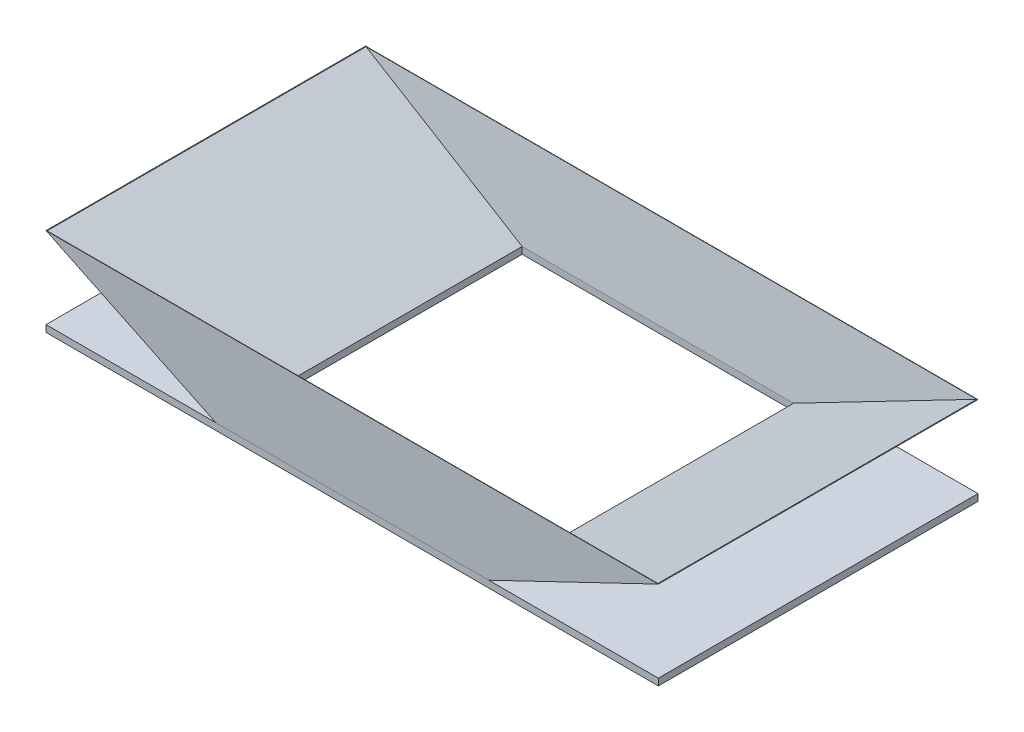
ISO-10303-21;
HEADER;
FILE_DESCRIPTION(('STEP AP214'),'2;1');
FILE_NAME('part.step','',(''),(''),'','','');
FILE_SCHEMA(('AUTOMOTIVE_DESIGN { 1 0 10303 214 1 1 1 1 }'));
ENDSEC;
DATA;
#1=APPLICATION_CONTEXT('core data for automotive mechanical design processes');
#2=APPLICATION_PROTOCOL_DEFINITION('international standard','automotive_design',2000,#1);
#3=PRODUCT_CONTEXT('',#1,'mechanical');
#4=PRODUCT('Part','Part','',(#3));
#5=PRODUCT_RELATED_PRODUCT_CATEGORY('part','',(#4));
#6=PRODUCT_DEFINITION_FORMATION('','',#4);
#7=PRODUCT_DEFINITION_CONTEXT('part definition',#1,'design');
#8=PRODUCT_DEFINITION('design','',#6,#7);
#9=PRODUCT_DEFINITION_SHAPE('','',#8);
#10=(LENGTH_UNIT() NAMED_UNIT(*) SI_UNIT(.MILLI.,.METRE.));
#11=(NAMED_UNIT(*) PLANE_ANGLE_UNIT() SI_UNIT($,.RADIAN.));
#12=(NAMED_UNIT(*) SI_UNIT($,.STERADIAN.) SOLID_ANGLE_UNIT());
#13=UNCERTAINTY_MEASURE_WITH_UNIT(LENGTH_MEASURE(1.E-05),#10,'distance_accuracy_value','');
#14=(GEOMETRIC_REPRESENTATION_CONTEXT(3) GLOBAL_UNCERTAINTY_ASSIGNED_CONTEXT((#13)) GLOBAL_UNIT_ASSIGNED_CONTEXT((#10,
#11,#12)) REPRESENTATION_CONTEXT('',''));
#15=CARTESIAN_POINT('',(0.,0.,0.));
#16=DIRECTION('',(0.,0.,1.));
#17=DIRECTION('',(1.,0.,0.));
#18=AXIS2_PLACEMENT_3D('',#15,#16,#17);
#19=CARTESIAN_POINT('',(0.,0.,0.));
#20=DIRECTION('',(0.,1.,0.));
#21=DIRECTION('',(0.,0.,1.));
#22=AXIS2_PLACEMENT_3D('',#19,#20,#21);
#23=PLANE('',#22);
#24=DIRECTION('',(0.,0.,1.));
#25=VECTOR('',#24,1.);
#26=CARTESIAN_POINT('',(-229.18696964241,0.,-124.717503613783));
#27=LINE('',#26,#25);
#28=CARTESIAN_POINT('',(-229.18696964241,0.,-124.717503613783));
#29=VERTEX_POINT('',#28);
#30=CARTESIAN_POINT('',(-229.18696964241,0.,114.554));
#31=VERTEX_POINT('',#30);
#32=EDGE_CURVE('E269',#29,#31,#27,.T.);
#33=ORIENTED_EDGE('',*,*,#32,.T.);
#34=DIRECTION('',(1.,0.,0.));
#35=VECTOR('',#34,1.);
#36=CARTESIAN_POINT('',(-229.18696964241,0.,114.554));
#37=LINE('',#36,#35);
#38=CARTESIAN_POINT('',(229.18696964241,0.,114.554));
#39=VERTEX_POINT('',#38);
#40=EDGE_CURVE('E273',#31,#39,#37,.T.);
#41=ORIENTED_EDGE('',*,*,#40,.T.);
#42=DIRECTION('',(0.,0.,-1.));
#43=VECTOR('',#42,1.);
#44=CARTESIAN_POINT('',(229.18696964241,0.,-124.717503613783));
#45=LINE('',#44,#43);
#46=CARTESIAN_POINT('',(229.18696964241,0.,-124.717503613783));
#47=VERTEX_POINT('',#46);
#48=EDGE_CURVE('E277',#39,#47,#45,.T.);
#49=ORIENTED_EDGE('',*,*,#48,.T.);
#50=DIRECTION('',(-1.,0.,0.));
#51=VECTOR('',#50,1.);
#52=CARTESIAN_POINT('',(-229.18696964241,0.,-124.717503613783));
#53=LINE('',#52,#51);
#54=EDGE_CURVE('E280',#47,#29,#53,.T.);
#55=ORIENTED_EDGE('',*,*,#54,.T.);
#56=EDGE_LOOP('',(#33,#41,#49,#55));
#57=FACE_BOUND('',#56,.T.);
#58=DIRECTION('',(1.,0.,0.));
#59=VECTOR('',#58,1.);
#60=CARTESIAN_POINT('',(-101.6,0.,114.3));
#61=LINE('',#60,#59);
#62=CARTESIAN_POINT('',(-101.6,0.,114.3));
#63=VERTEX_POINT('',#62);
#64=CARTESIAN_POINT('',(101.6,0.,114.3));
#65=VERTEX_POINT('',#64);
#66=EDGE_CURVE('E230',#63,#65,#61,.T.);
#67=ORIENTED_EDGE('',*,*,#66,.F.);
#68=DIRECTION('',(0.,0.,1.));
#69=VECTOR('',#68,1.);
#70=CARTESIAN_POINT('',(-101.6,0.,-114.3));
#71=LINE('',#70,#69);
#72=CARTESIAN_POINT('',(-101.6,0.,-114.3));
#73=VERTEX_POINT('',#72);
#74=EDGE_CURVE('E221',#73,#63,#71,.T.);
#75=ORIENTED_EDGE('',*,*,#74,.F.);
#76=DIRECTION('',(-1.,0.,0.));
#77=VECTOR('',#76,1.);
#78=CARTESIAN_POINT('',(-101.6,0.,-114.3));
#79=LINE('',#78,#77);
#80=CARTESIAN_POINT('',(101.6,0.,-114.3));
#81=VERTEX_POINT('',#80);
#82=EDGE_CURVE('E247',#81,#73,#79,.T.);
#83=ORIENTED_EDGE('',*,*,#82,.F.);
#84=DIRECTION('',(0.,0.,-1.));
#85=VECTOR('',#84,1.);
#86=CARTESIAN_POINT('',(101.6,0.,-114.3));
#87=LINE('',#86,#85);
#88=EDGE_CURVE('E243',#65,#81,#87,.T.);
#89=ORIENTED_EDGE('',*,*,#88,.F.);
#90=EDGE_LOOP('',(#67,#75,#83,#89));
#91=FACE_BOUND('',#90,.T.);
#92=ADVANCED_FACE('F155',(#57,#91),#23,.T.);
#93=CARTESIAN_POINT('',(0.,-5.08,0.));
#94=DIRECTION('',(0.,1.,0.));
#95=DIRECTION('',(0.,0.,1.));
#96=AXIS2_PLACEMENT_3D('',#93,#94,#95);
#97=PLANE('',#96);
#98=DIRECTION('',(0.,0.,1.));
#99=VECTOR('',#98,1.);
#100=CARTESIAN_POINT('',(-229.18696964241,-5.08,-124.717503613783));
#101=LINE('',#100,#99);
#102=CARTESIAN_POINT('',(-229.18696964241,-5.08,-124.717503613783));
#103=VERTEX_POINT('',#102);
#104=CARTESIAN_POINT('',(-229.18696964241,-5.08,114.554));
#105=VERTEX_POINT('',#104);
#106=EDGE_CURVE('E239',#103,#105,#101,.T.);
#107=ORIENTED_EDGE('',*,*,#106,.F.);
#108=DIRECTION('',(-1.,0.,0.));
#109=VECTOR('',#108,1.);
#110=CARTESIAN_POINT('',(-229.18696964241,-5.08,-124.717503613783));
#111=LINE('',#110,#109);
#112=CARTESIAN_POINT('',(229.18696964241,-5.08,-124.717503613783));
#113=VERTEX_POINT('',#112);
#114=EDGE_CURVE('E274',#113,#103,#111,.T.);
#115=ORIENTED_EDGE('',*,*,#114,.F.);
#116=DIRECTION('',(0.,0.,-1.));
#117=VECTOR('',#116,1.);
#118=CARTESIAN_POINT('',(229.18696964241,-5.08,-124.717503613783));
#119=LINE('',#118,#117);
#120=CARTESIAN_POINT('',(229.18696964241,-5.08,114.554));
#121=VERTEX_POINT('',#120);
#122=EDGE_CURVE('E290',#121,#113,#119,.T.);
#123=ORIENTED_EDGE('',*,*,#122,.F.);
#124=DIRECTION('',(1.,0.,0.));
#125=VECTOR('',#124,1.);
#126=CARTESIAN_POINT('',(-229.18696964241,-5.08,114.554));
#127=LINE('',#126,#125);
#128=EDGE_CURVE('E287',#105,#121,#127,.T.);
#129=ORIENTED_EDGE('',*,*,#128,.F.);
#130=EDGE_LOOP('',(#107,#115,#123,#129));
#131=FACE_BOUND('',#130,.T.);
#132=DIRECTION('',(0.,0.,1.));
#133=VECTOR('',#132,1.);
#134=CARTESIAN_POINT('',(-101.6,-5.08,-114.3));
#135=LINE('',#134,#133);
#136=CARTESIAN_POINT('',(-101.6,-5.08,-114.3));
#137=VERTEX_POINT('',#136);
#138=CARTESIAN_POINT('',(-101.6,-5.08,114.3));
#139=VERTEX_POINT('',#138);
#140=EDGE_CURVE('E179',#137,#139,#135,.T.);
#141=ORIENTED_EDGE('',*,*,#140,.T.);
#142=DIRECTION('',(1.,0.,0.));
#143=VECTOR('',#142,1.);
#144=CARTESIAN_POINT('',(-101.6,-5.08,114.3));
#145=LINE('',#144,#143);
#146=CARTESIAN_POINT('',(101.6,-5.08,114.3));
#147=VERTEX_POINT('',#146);
#148=EDGE_CURVE('E237',#139,#147,#145,.T.);
#149=ORIENTED_EDGE('',*,*,#148,.T.);
#150=DIRECTION('',(0.,0.,-1.));
#151=VECTOR('',#150,1.);
#152=CARTESIAN_POINT('',(101.6,-5.08,-114.3));
#153=LINE('',#152,#151);
#154=CARTESIAN_POINT('',(101.6,-5.08,-114.3));
#155=VERTEX_POINT('',#154);
#156=EDGE_CURVE('E256',#147,#155,#153,.T.);
#157=ORIENTED_EDGE('',*,*,#156,.T.);
#158=DIRECTION('',(-1.,0.,0.));
#159=VECTOR('',#158,1.);
#160=CARTESIAN_POINT('',(-101.6,-5.08,-114.3));
#161=LINE('',#160,#159);
#162=EDGE_CURVE('E231',#155,#137,#161,.T.);
#163=ORIENTED_EDGE('',*,*,#162,.T.);
#164=EDGE_LOOP('',(#141,#149,#157,#163));
#165=FACE_BOUND('',#164,.T.);
#166=ADVANCED_FACE('F313',(#131,#165),#97,.F.);
#167=CARTESIAN_POINT('',(-229.18696964241,0.,-124.717503613783));
#168=DIRECTION('',(1.,0.,0.));
#169=DIRECTION('',(0.,0.,-1.));
#170=AXIS2_PLACEMENT_3D('',#167,#168,#169);
#171=PLANE('',#170);
#172=ORIENTED_EDGE('',*,*,#106,.T.);
#173=DIRECTION('',(0.,-1.,0.));
#174=VECTOR('',#173,1.);
#175=CARTESIAN_POINT('',(-229.18696964241,0.,114.554));
#176=LINE('',#175,#174);
#177=EDGE_CURVE('E13',#31,#105,#176,.T.);
#178=ORIENTED_EDGE('',*,*,#177,.F.);
#179=ORIENTED_EDGE('',*,*,#32,.F.);
#180=DIRECTION('',(0.,-1.,0.));
#181=VECTOR('',#180,1.);
#182=CARTESIAN_POINT('',(-229.18696964241,0.,-124.717503613783));
#183=LINE('',#182,#181);
#184=EDGE_CURVE('E283',#29,#103,#183,.T.);
#185=ORIENTED_EDGE('',*,*,#184,.T.);
#186=EDGE_LOOP('',(#172,#178,#179,#185));
#187=FACE_BOUND('',#186,.T.);
#188=ADVANCED_FACE('F157',(#187),#171,.F.);
#189=CARTESIAN_POINT('',(-229.18696964241,0.,114.554));
#190=DIRECTION('',(0.,0.,-1.));
#191=DIRECTION('',(-1.,0.,0.));
#192=AXIS2_PLACEMENT_3D('',#189,#190,#191);
#193=PLANE('',#192);
#194=ORIENTED_EDGE('',*,*,#128,.T.);
#195=DIRECTION('',(0.,-1.,0.));
#196=VECTOR('',#195,1.);
#197=CARTESIAN_POINT('',(229.18696964241,0.,114.554));
#198=LINE('',#197,#196);
#199=EDGE_CURVE('E164',#39,#121,#198,.T.);
#200=ORIENTED_EDGE('',*,*,#199,.F.);
#201=ORIENTED_EDGE('',*,*,#40,.F.);
#202=ORIENTED_EDGE('',*,*,#177,.T.);
#203=EDGE_LOOP('',(#194,#200,#201,#202));
#204=FACE_BOUND('',#203,.T.);
#205=ADVANCED_FACE('F323',(#204),#193,.F.);
#206=CARTESIAN_POINT('',(229.18696964241,0.,-124.717503613783));
#207=DIRECTION('',(-1.,0.,0.));
#208=DIRECTION('',(0.,0.,1.));
#209=AXIS2_PLACEMENT_3D('',#206,#207,#208);
#210=PLANE('',#209);
#211=ORIENTED_EDGE('',*,*,#122,.T.);
#212=DIRECTION('',(0.,-1.,0.));
#213=VECTOR('',#212,1.);
#214=CARTESIAN_POINT('',(229.18696964241,0.,-124.717503613783));
#215=LINE('',#214,#213);
#216=EDGE_CURVE('E298',#47,#113,#215,.T.);
#217=ORIENTED_EDGE('',*,*,#216,.F.);
#218=ORIENTED_EDGE('',*,*,#48,.F.);
#219=ORIENTED_EDGE('',*,*,#199,.T.);
#220=EDGE_LOOP('',(#211,#217,#218,#219));
#221=FACE_BOUND('',#220,.T.);
#222=ADVANCED_FACE('F307',(#221),#210,.F.);
#223=CARTESIAN_POINT('',(-229.18696964241,0.,-124.717503613783));
#224=DIRECTION('',(0.,0.,1.));
#225=DIRECTION('',(1.,0.,0.));
#226=AXIS2_PLACEMENT_3D('',#223,#224,#225);
#227=PLANE('',#226);
#228=ORIENTED_EDGE('',*,*,#114,.T.);
#229=ORIENTED_EDGE('',*,*,#184,.F.);
#230=ORIENTED_EDGE('',*,*,#54,.F.);
#231=ORIENTED_EDGE('',*,*,#216,.T.);
#232=EDGE_LOOP('',(#228,#229,#230,#231));
#233=FACE_BOUND('',#232,.T.);
#234=ADVANCED_FACE('F317',(#233),#227,.F.);
#235=CARTESIAN_POINT('',(-101.6,0.,-114.3));
#236=DIRECTION('',(1.,0.,0.));
#237=DIRECTION('',(0.,0.,-1.));
#238=AXIS2_PLACEMENT_3D('',#235,#236,#237);
#239=PLANE('',#238);
#240=ORIENTED_EDGE('',*,*,#140,.F.);
#241=DIRECTION('',(0.,-1.,0.));
#242=VECTOR('',#241,1.);
#243=CARTESIAN_POINT('',(-101.6,0.,-114.3));
#244=LINE('',#243,#242);
#245=EDGE_CURVE('E225',#73,#137,#244,.T.);
#246=ORIENTED_EDGE('',*,*,#245,.F.);
#247=ORIENTED_EDGE('',*,*,#74,.T.);
#248=DIRECTION('',(0.,-1.,0.));
#249=VECTOR('',#248,1.);
#250=CARTESIAN_POINT('',(-101.6,0.,114.3));
#251=LINE('',#250,#249);
#252=EDGE_CURVE('E224',#63,#139,#251,.T.);
#253=ORIENTED_EDGE('',*,*,#252,.T.);
#254=EDGE_LOOP('',(#240,#246,#247,#253));
#255=FACE_BOUND('',#254,.T.);
#256=ADVANCED_FACE('F223',(#255),#239,.T.);
#257=CARTESIAN_POINT('',(-101.6,0.,114.3));
#258=DIRECTION('',(0.,0.,-1.));
#259=DIRECTION('',(-1.,0.,0.));
#260=AXIS2_PLACEMENT_3D('',#257,#258,#259);
#261=PLANE('',#260);
#262=ORIENTED_EDGE('',*,*,#148,.F.);
#263=ORIENTED_EDGE('',*,*,#252,.F.);
#264=ORIENTED_EDGE('',*,*,#66,.T.);
#265=DIRECTION('',(0.,-1.,0.));
#266=VECTOR('',#265,1.);
#267=CARTESIAN_POINT('',(101.6,0.,114.3));
#268=LINE('',#267,#266);
#269=EDGE_CURVE('E240',#65,#147,#268,.T.);
#270=ORIENTED_EDGE('',*,*,#269,.T.);
#271=EDGE_LOOP('',(#262,#263,#264,#270));
#272=FACE_BOUND('',#271,.T.);
#273=ADVANCED_FACE('F234',(#272),#261,.T.);
#274=CARTESIAN_POINT('',(101.6,0.,-114.3));
#275=DIRECTION('',(-1.,0.,0.));
#276=DIRECTION('',(0.,0.,1.));
#277=AXIS2_PLACEMENT_3D('',#274,#275,#276);
#278=PLANE('',#277);
#279=ORIENTED_EDGE('',*,*,#156,.F.);
#280=ORIENTED_EDGE('',*,*,#269,.F.);
#281=ORIENTED_EDGE('',*,*,#88,.T.);
#282=DIRECTION('',(0.,-1.,0.));
#283=VECTOR('',#282,1.);
#284=CARTESIAN_POINT('',(101.6,0.,-114.3));
#285=LINE('',#284,#283);
#286=EDGE_CURVE('E171',#81,#155,#285,.T.);
#287=ORIENTED_EDGE('',*,*,#286,.T.);
#288=EDGE_LOOP('',(#279,#280,#281,#287));
#289=FACE_BOUND('',#288,.T.);
#290=ADVANCED_FACE('F346',(#289),#278,.T.);
#291=CARTESIAN_POINT('',(-101.6,0.,-114.3));
#292=DIRECTION('',(0.,0.,1.));
#293=DIRECTION('',(1.,0.,0.));
#294=AXIS2_PLACEMENT_3D('',#291,#292,#293);
#295=PLANE('',#294);
#296=ORIENTED_EDGE('',*,*,#162,.F.);
#297=ORIENTED_EDGE('',*,*,#286,.F.);
#298=ORIENTED_EDGE('',*,*,#82,.T.);
#299=ORIENTED_EDGE('',*,*,#245,.T.);
#300=EDGE_LOOP('',(#296,#297,#298,#299));
#301=FACE_BOUND('',#300,.T.);
#302=ADVANCED_FACE('F350',(#301),#295,.T.);
#303=CLOSED_SHELL('',(#92,#166,#188,#205,#222,#234,#256,#273,#290,#302));
#304=MANIFOLD_SOLID_BREP('B2',#303);
#305=CARTESIAN_POINT('',(0.,60.96,0.));
#306=DIRECTION('',(0.,1.,0.));
#307=DIRECTION('',(0.,0.,1.));
#308=AXIS2_PLACEMENT_3D('',#305,#306,#307);
#309=PLANE('',#308);
#310=DIRECTION('',(1.,0.,0.));
#311=VECTOR('',#310,1.);
#312=CARTESIAN_POINT('',(0.,60.96,-124.717503613783));
#313=LINE('',#312,#311);
#314=CARTESIAN_POINT('',(-229.18696964241,60.96,-124.717503613783));
#315=VERTEX_POINT('',#314);
#316=CARTESIAN_POINT('',(229.18696964241,60.96,-124.717503613783));
#317=VERTEX_POINT('',#316);
#318=EDGE_CURVE('E418',#315,#317,#313,.T.);
#319=ORIENTED_EDGE('',*,*,#318,.F.);
#320=DIRECTION('',(0.,0.,-1.));
#321=VECTOR('',#320,1.);
#322=CARTESIAN_POINT('',(-229.18696964241,60.96,0.));
#323=LINE('',#322,#321);
#324=CARTESIAN_POINT('',(-229.18696964241,60.96,114.554));
#325=VERTEX_POINT('',#324);
#326=EDGE_CURVE('E512',#325,#315,#323,.T.);
#327=ORIENTED_EDGE('',*,*,#326,.F.);
#328=DIRECTION('',(1.,0.,0.));
#329=VECTOR('',#328,1.);
#330=CARTESIAN_POINT('',(0.,60.96,114.554));
#331=LINE('',#330,#329);
#332=CARTESIAN_POINT('',(229.18696964241,60.96,114.554));
#333=VERTEX_POINT('',#332);
#334=EDGE_CURVE('E526',#325,#333,#331,.T.);
#335=ORIENTED_EDGE('',*,*,#334,.T.);
#336=DIRECTION('',(0.,0.,-1.));
#337=VECTOR('',#336,1.);
#338=CARTESIAN_POINT('',(229.18696964241,60.96,0.));
#339=LINE('',#338,#337);
#340=EDGE_CURVE('E413',#333,#317,#339,.T.);
#341=ORIENTED_EDGE('',*,*,#340,.T.);
#342=EDGE_LOOP('',(#319,#327,#335,#341));
#343=FACE_BOUND('',#342,.T.);
#344=DIRECTION('',(0.,0.,-1.));
#345=VECTOR('',#344,1.);
#346=CARTESIAN_POINT('',(-228.6,60.96,0.));
#347=LINE('',#346,#345);
#348=CARTESIAN_POINT('',(-228.6,60.96,114.3));
#349=VERTEX_POINT('',#348);
#350=CARTESIAN_POINT('',(-228.6,60.96,-124.46));
#351=VERTEX_POINT('',#350);
#352=EDGE_CURVE('E480',#349,#351,#347,.T.);
#353=ORIENTED_EDGE('',*,*,#352,.T.);
#354=DIRECTION('',(1.,0.,0.));
#355=VECTOR('',#354,1.);
#356=CARTESIAN_POINT('',(0.,60.96,-124.46));
#357=LINE('',#356,#355);
#358=CARTESIAN_POINT('',(228.6,60.96,-124.46));
#359=VERTEX_POINT('',#358);
#360=EDGE_CURVE('E490',#351,#359,#357,.T.);
#361=ORIENTED_EDGE('',*,*,#360,.T.);
#362=DIRECTION('',(0.,0.,-1.));
#363=VECTOR('',#362,1.);
#364=CARTESIAN_POINT('',(228.6,60.96,0.));
#365=LINE('',#364,#363);
#366=CARTESIAN_POINT('',(228.6,60.96,114.3));
#367=VERTEX_POINT('',#366);
#368=EDGE_CURVE('E507',#367,#359,#365,.T.);
#369=ORIENTED_EDGE('',*,*,#368,.F.);
#370=DIRECTION('',(1.,0.,0.));
#371=VECTOR('',#370,1.);
#372=CARTESIAN_POINT('',(0.,60.96,114.3));
#373=LINE('',#372,#371);
#374=EDGE_CURVE('E499',#349,#367,#373,.T.);
#375=ORIENTED_EDGE('',*,*,#374,.F.);
#376=EDGE_LOOP('',(#353,#361,#369,#375));
#377=FACE_BOUND('',#376,.T.);
#378=ADVANCED_FACE('F409',(#343,#377),#309,.T.);
#379=CARTESIAN_POINT('',(0.,0.,0.));
#380=DIRECTION('',(0.,-1.,0.));
#381=DIRECTION('',(0.,0.,-1.));
#382=AXIS2_PLACEMENT_3D('',#379,#380,#381);
#383=PLANE('',#382);
#384=DIRECTION('',(1.,0.,0.));
#385=VECTOR('',#384,1.);
#386=CARTESIAN_POINT('',(0.,0.,-114.3));
#387=LINE('',#386,#385);
#388=CARTESIAN_POINT('',(-101.6,0.,-114.3));
#389=VERTEX_POINT('',#388);
#390=CARTESIAN_POINT('',(101.6,0.,-114.3));
#391=VERTEX_POINT('',#390);
#392=EDGE_CURVE('E495',#389,#391,#387,.T.);
#393=ORIENTED_EDGE('',*,*,#392,.F.);
#394=DIRECTION('',(0.,0.,1.));
#395=VECTOR('',#394,1.);
#396=CARTESIAN_POINT('',(-101.6,0.,0.));
#397=LINE('',#396,#395);
#398=CARTESIAN_POINT('',(-101.6,0.,114.3));
#399=VERTEX_POINT('',#398);
#400=EDGE_CURVE('E482',#389,#399,#397,.T.);
#401=ORIENTED_EDGE('',*,*,#400,.T.);
#402=DIRECTION('',(1.,0.,0.));
#403=VECTOR('',#402,1.);
#404=CARTESIAN_POINT('',(0.,0.,114.3));
#405=LINE('',#404,#403);
#406=CARTESIAN_POINT('',(101.6,0.,114.3));
#407=VERTEX_POINT('',#406);
#408=EDGE_CURVE('E433',#399,#407,#405,.T.);
#409=ORIENTED_EDGE('',*,*,#408,.T.);
#410=DIRECTION('',(0.,0.,1.));
#411=VECTOR('',#410,1.);
#412=CARTESIAN_POINT('',(101.6,0.,0.));
#413=LINE('',#412,#411);
#414=EDGE_CURVE('E496',#391,#407,#413,.T.);
#415=ORIENTED_EDGE('',*,*,#414,.F.);
#416=EDGE_LOOP('',(#393,#401,#409,#415));
#417=FACE_BOUND('',#416,.T.);
#418=DIRECTION('',(1.,0.,0.));
#419=VECTOR('',#418,1.);
#420=CARTESIAN_POINT('',(0.,0.,-114.557503613783));
#421=LINE('',#420,#419);
#422=CARTESIAN_POINT('',(-102.18696964241,0.,-114.557503613783));
#423=VERTEX_POINT('',#422);
#424=CARTESIAN_POINT('',(102.18696964241,0.,-114.557503613783));
#425=VERTEX_POINT('',#424);
#426=EDGE_CURVE('E153',#423,#425,#421,.T.);
#427=ORIENTED_EDGE('',*,*,#426,.T.);
#428=DIRECTION('',(0.,0.,1.));
#429=VECTOR('',#428,1.);
#430=CARTESIAN_POINT('',(102.18696964241,0.,0.));
#431=LINE('',#430,#429);
#432=CARTESIAN_POINT('',(102.18696964241,0.,114.554));
#433=VERTEX_POINT('',#432);
#434=EDGE_CURVE('E516',#425,#433,#431,.T.);
#435=ORIENTED_EDGE('',*,*,#434,.T.);
#436=DIRECTION('',(1.,0.,0.));
#437=VECTOR('',#436,1.);
#438=CARTESIAN_POINT('',(0.,0.,114.554));
#439=LINE('',#438,#437);
#440=CARTESIAN_POINT('',(-102.18696964241,0.,114.554));
#441=VERTEX_POINT('',#440);
#442=EDGE_CURVE('E525',#441,#433,#439,.T.);
#443=ORIENTED_EDGE('',*,*,#442,.F.);
#444=DIRECTION('',(0.,0.,1.));
#445=VECTOR('',#444,1.);
#446=CARTESIAN_POINT('',(-102.18696964241,0.,0.));
#447=LINE('',#446,#445);
#448=EDGE_CURVE('E521',#423,#441,#447,.T.);
#449=ORIENTED_EDGE('',*,*,#448,.F.);
#450=EDGE_LOOP('',(#427,#435,#443,#449));
#451=FACE_BOUND('',#450,.T.);
#452=ADVANCED_FACE('F553',(#417,#451),#383,.T.);
#453=CARTESIAN_POINT('',(0.,-18.5768924779107,-111.461354867464));
#454=DIRECTION('',(0.,0.164398987305357,0.986393923832144));
#455=DIRECTION('',(0.,-0.986393923832144,0.164398987305357));
#456=AXIS2_PLACEMENT_3D('',#453,#454,#455);
#457=PLANE('',#456);
#458=DIRECTION('',(0.899187501582008,0.431610000759364,-0.0719350001265607));
#459=VECTOR('',#458,1.);
#460=CARTESIAN_POINT('',(12.1549758426748,-43.215357023873,-107.354944109804));
#461=LINE('',#460,#459);
#462=EDGE_CURVE('E513',#425,#317,#461,.T.);
#463=ORIENTED_EDGE('',*,*,#462,.F.);
#464=ORIENTED_EDGE('',*,*,#426,.F.);
#465=DIRECTION('',(-0.899187501582008,0.431610000759364,-0.0719350001265607));
#466=VECTOR('',#465,1.);
#467=CARTESIAN_POINT('',(-12.1549758426747,-43.215357023873,-107.354944109804));
#468=LINE('',#467,#466);
#469=EDGE_CURVE('E517',#423,#315,#468,.T.);
#470=ORIENTED_EDGE('',*,*,#469,.T.);
#471=ORIENTED_EDGE('',*,*,#318,.T.);
#472=EDGE_LOOP('',(#463,#464,#470,#471));
#473=FACE_BOUND('',#472,.T.);
#474=ADVANCED_FACE('F549',(#473),#457,.F.);
#475=CARTESIAN_POINT('',(19.135141259437,-39.8648776238271,0.));
#476=DIRECTION('',(-0.432731067584771,0.901523057468274,0.));
#477=DIRECTION('',(-0.901523057468274,-0.432731067584771,0.));
#478=AXIS2_PLACEMENT_3D('',#475,#476,#477);
#479=PLANE('',#478);
#480=DIRECTION('',(0.901523057468274,0.432731067584771,0.));
#481=VECTOR('',#480,1.);
#482=CARTESIAN_POINT('',(19.135141259437,-39.8648776238271,114.554));
#483=LINE('',#482,#481);
#484=EDGE_CURVE('E522',#433,#333,#483,.T.);
#485=ORIENTED_EDGE('',*,*,#484,.F.);
#486=ORIENTED_EDGE('',*,*,#434,.F.);
#487=ORIENTED_EDGE('',*,*,#462,.T.);
#488=ORIENTED_EDGE('',*,*,#340,.F.);
#489=EDGE_LOOP('',(#485,#486,#487,#488));
#490=FACE_BOUND('',#489,.T.);
#491=ADVANCED_FACE('F546',(#490),#479,.F.);
#492=CARTESIAN_POINT('',(0.,0.,114.554));
#493=DIRECTION('',(0.,0.,-1.));
#494=DIRECTION('',(-1.,0.,0.));
#495=AXIS2_PLACEMENT_3D('',#492,#493,#494);
#496=PLANE('',#495);
#497=DIRECTION('',(-0.901523057468274,0.432731067584771,0.));
#498=VECTOR('',#497,1.);
#499=CARTESIAN_POINT('',(-19.135141259437,-39.8648776238271,114.554));
#500=LINE('',#499,#498);
#501=EDGE_CURVE('E520',#441,#325,#500,.T.);
#502=ORIENTED_EDGE('',*,*,#501,.F.);
#503=ORIENTED_EDGE('',*,*,#442,.T.);
#504=ORIENTED_EDGE('',*,*,#484,.T.);
#505=ORIENTED_EDGE('',*,*,#334,.F.);
#506=EDGE_LOOP('',(#502,#503,#504,#505));
#507=FACE_BOUND('',#506,.T.);
#508=ADVANCED_FACE('F542',(#507),#496,.F.);
#509=CARTESIAN_POINT('',(-19.135141259437,-39.8648776238271,0.));
#510=DIRECTION('',(-0.432731067584771,-0.901523057468274,0.));
#511=DIRECTION('',(0.901523057468274,-0.432731067584771,0.));
#512=AXIS2_PLACEMENT_3D('',#509,#510,#511);
#513=PLANE('',#512);
#514=ORIENTED_EDGE('',*,*,#469,.F.);
#515=ORIENTED_EDGE('',*,*,#448,.T.);
#516=ORIENTED_EDGE('',*,*,#501,.T.);
#517=ORIENTED_EDGE('',*,*,#326,.T.);
#518=EDGE_LOOP('',(#514,#515,#516,#517));
#519=FACE_BOUND('',#518,.T.);
#520=ADVANCED_FACE('F411',(#519),#513,.T.);
#521=CARTESIAN_POINT('',(0.,-18.5351351351351,-111.210810810811));
#522=DIRECTION('',(0.,0.164398987305357,0.986393923832144));
#523=DIRECTION('',(0.,-0.986393923832144,0.164398987305357));
#524=AXIS2_PLACEMENT_3D('',#521,#522,#523);
#525=PLANE('',#524);
#526=DIRECTION('',(0.899187501582008,0.431610000759364,-0.0719350001265607));
#527=VECTOR('',#526,1.);
#528=CARTESIAN_POINT('',(101.6,0.,-114.3));
#529=LINE('',#528,#527);
#530=EDGE_CURVE('E492',#391,#359,#529,.T.);
#531=ORIENTED_EDGE('',*,*,#530,.T.);
#532=ORIENTED_EDGE('',*,*,#360,.F.);
#533=DIRECTION('',(-0.899187501582008,0.431610000759364,-0.0719350001265607));
#534=VECTOR('',#533,1.);
#535=CARTESIAN_POINT('',(-101.6,0.,-114.3));
#536=LINE('',#535,#534);
#537=EDGE_CURVE('E476',#389,#351,#536,.T.);
#538=ORIENTED_EDGE('',*,*,#537,.F.);
#539=ORIENTED_EDGE('',*,*,#392,.T.);
#540=EDGE_LOOP('',(#531,#532,#538,#539));
#541=FACE_BOUND('',#540,.T.);
#542=ADVANCED_FACE('F491',(#541),#525,.T.);
#543=CARTESIAN_POINT('',(19.0252275682705,-39.6358907672302,0.));
#544=DIRECTION('',(-0.432731067584771,0.901523057468274,0.));
#545=DIRECTION('',(-0.901523057468274,-0.432731067584771,0.));
#546=AXIS2_PLACEMENT_3D('',#543,#544,#545);
#547=PLANE('',#546);
#548=DIRECTION('',(0.901523057468274,0.432731067584771,0.));
#549=VECTOR('',#548,1.);
#550=CARTESIAN_POINT('',(101.6,0.,114.3));
#551=LINE('',#550,#549);
#552=EDGE_CURVE('E426',#407,#367,#551,.T.);
#553=ORIENTED_EDGE('',*,*,#552,.T.);
#554=ORIENTED_EDGE('',*,*,#368,.T.);
#555=ORIENTED_EDGE('',*,*,#530,.F.);
#556=ORIENTED_EDGE('',*,*,#414,.T.);
#557=EDGE_LOOP('',(#553,#554,#555,#556));
#558=FACE_BOUND('',#557,.T.);
#559=ADVANCED_FACE('F573',(#558),#547,.T.);
#560=CARTESIAN_POINT('',(0.,0.,114.3));
#561=DIRECTION('',(0.,0.,-1.));
#562=DIRECTION('',(-1.,0.,0.));
#563=AXIS2_PLACEMENT_3D('',#560,#561,#562);
#564=PLANE('',#563);
#565=DIRECTION('',(-0.901523057468274,0.432731067584771,0.));
#566=VECTOR('',#565,1.);
#567=CARTESIAN_POINT('',(-101.6,0.,114.3));
#568=LINE('',#567,#566);
#569=EDGE_CURVE('E486',#399,#349,#568,.T.);
#570=ORIENTED_EDGE('',*,*,#569,.T.);
#571=ORIENTED_EDGE('',*,*,#374,.T.);
#572=ORIENTED_EDGE('',*,*,#552,.F.);
#573=ORIENTED_EDGE('',*,*,#408,.F.);
#574=EDGE_LOOP('',(#570,#571,#572,#573));
#575=FACE_BOUND('',#574,.T.);
#576=ADVANCED_FACE('F577',(#575),#564,.T.);
#577=CARTESIAN_POINT('',(-19.0252275682705,-39.6358907672302,0.));
#578=DIRECTION('',(-0.432731067584771,-0.901523057468274,0.));
#579=DIRECTION('',(0.901523057468274,-0.432731067584771,0.));
#580=AXIS2_PLACEMENT_3D('',#577,#578,#579);
#581=PLANE('',#580);
#582=ORIENTED_EDGE('',*,*,#537,.T.);
#583=ORIENTED_EDGE('',*,*,#352,.F.);
#584=ORIENTED_EDGE('',*,*,#569,.F.);
#585=ORIENTED_EDGE('',*,*,#400,.F.);
#586=EDGE_LOOP('',(#582,#583,#584,#585));
#587=FACE_BOUND('',#586,.T.);
#588=ADVANCED_FACE('F478',(#587),#581,.F.);
#589=CLOSED_SHELL('',(#378,#452,#474,#491,#508,#520,#542,#559,#576,#588));
#590=MANIFOLD_SOLID_BREP('B7',#589);
#591=ADVANCED_BREP_SHAPE_REPRESENTATION('',(#18,#304,#590),#14);
#592=SHAPE_DEFINITION_REPRESENTATION(#9,#591);
ENDSEC;
END-ISO-10303-21;
